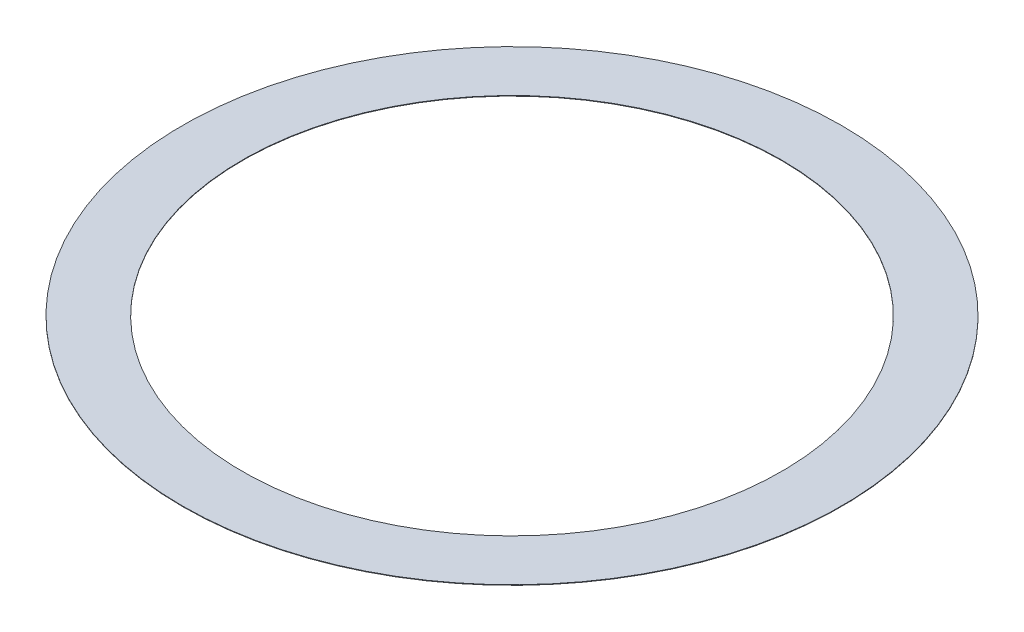
ISO-10303-21;
HEADER;
FILE_DESCRIPTION(('STEP AP214'),'2;1');
FILE_NAME('part.step','',(''),(''),'','','');
FILE_SCHEMA(('AUTOMOTIVE_DESIGN { 1 0 10303 214 1 1 1 1 }'));
ENDSEC;
DATA;
#1=APPLICATION_CONTEXT('core data for automotive mechanical design processes');
#2=APPLICATION_PROTOCOL_DEFINITION('international standard','automotive_design',2000,#1);
#3=PRODUCT_CONTEXT('',#1,'mechanical');
#4=PRODUCT('Part','Part','',(#3));
#5=PRODUCT_RELATED_PRODUCT_CATEGORY('part','',(#4));
#6=PRODUCT_DEFINITION_FORMATION('','',#4);
#7=PRODUCT_DEFINITION_CONTEXT('part definition',#1,'design');
#8=PRODUCT_DEFINITION('design','',#6,#7);
#9=PRODUCT_DEFINITION_SHAPE('','',#8);
#10=(LENGTH_UNIT() NAMED_UNIT(*) SI_UNIT(.MILLI.,.METRE.));
#11=(NAMED_UNIT(*) PLANE_ANGLE_UNIT() SI_UNIT($,.RADIAN.));
#12=(NAMED_UNIT(*) SI_UNIT($,.STERADIAN.) SOLID_ANGLE_UNIT());
#13=UNCERTAINTY_MEASURE_WITH_UNIT(LENGTH_MEASURE(1.E-05),#10,'distance_accuracy_value','');
#14=(GEOMETRIC_REPRESENTATION_CONTEXT(3) GLOBAL_UNCERTAINTY_ASSIGNED_CONTEXT((#13)) GLOBAL_UNIT_ASSIGNED_CONTEXT((#10,
#11,#12)) REPRESENTATION_CONTEXT('',''));
#15=CARTESIAN_POINT('',(0.,0.,0.));
#16=DIRECTION('',(0.,0.,1.));
#17=DIRECTION('',(1.,0.,0.));
#18=AXIS2_PLACEMENT_3D('',#15,#16,#17);
#19=CARTESIAN_POINT('',(4.61366756677371,1.4,-0.922645422350891));
#20=DIRECTION('',(0.,1.,0.));
#21=DIRECTION('',(0.,0.,1.));
#22=AXIS2_PLACEMENT_3D('',#19,#20,#21);
#23=PLANE('',#22);
#24=CARTESIAN_POINT('',(4.61366756677371,1.4,-0.922645422350891));
#25=DIRECTION('',(0.,-1.,0.));
#26=DIRECTION('',(0.,0.,-1.));
#27=AXIS2_PLACEMENT_3D('',#24,#25,#26);
#28=CIRCLE('',#27,0.534659599446457);
#29=CARTESIAN_POINT('',(4.61366756677371,1.4,-1.45730502179735));
#30=VERTEX_POINT('',#29);
#31=EDGE_CURVE('E26',#30,#30,#28,.F.);
#32=ORIENTED_EDGE('',*,*,#31,.T.);
#33=EDGE_LOOP('',(#32));
#34=FACE_BOUND('',#33,.T.);
#35=CARTESIAN_POINT('',(4.61366756677371,1.4,-0.922645422350891));
#36=DIRECTION('',(0.,-1.,0.));
#37=DIRECTION('',(0.,0.,-1.));
#38=AXIS2_PLACEMENT_3D('',#35,#36,#37);
#39=CIRCLE('',#38,0.653338309316951);
#40=CARTESIAN_POINT('',(4.61366756677371,1.4,-1.57598373166784));
#41=VERTEX_POINT('',#40);
#42=EDGE_CURVE('E35',#41,#41,#39,.F.);
#43=ORIENTED_EDGE('',*,*,#42,.F.);
#44=EDGE_LOOP('',(#43));
#45=FACE_BOUND('',#44,.T.);
#46=ADVANCED_FACE('F14',(#34,#45),#23,.F.);
#47=CARTESIAN_POINT('',(4.61366756677371,1.401,-0.922645422350891));
#48=DIRECTION('',(0.,-1.,0.));
#49=DIRECTION('',(0.,0.,-1.));
#50=AXIS2_PLACEMENT_3D('',#47,#48,#49);
#51=CYLINDRICAL_SURFACE('',#50,0.653338309316951);
#52=ORIENTED_EDGE('',*,*,#42,.T.);
#53=EDGE_LOOP('',(#52));
#54=FACE_BOUND('',#53,.T.);
#55=CARTESIAN_POINT('',(4.61366756677371,1.401,-0.922645422350891));
#56=DIRECTION('',(0.,-1.,0.));
#57=DIRECTION('',(0.,0.,-1.));
#58=AXIS2_PLACEMENT_3D('',#55,#56,#57);
#59=CIRCLE('',#58,0.653338309316951);
#60=CARTESIAN_POINT('',(4.61366756677371,1.401,-1.57598373166784));
#61=VERTEX_POINT('',#60);
#62=EDGE_CURVE('E21',#61,#61,#59,.F.);
#63=ORIENTED_EDGE('',*,*,#62,.F.);
#64=EDGE_LOOP('',(#63));
#65=FACE_BOUND('',#64,.T.);
#66=ADVANCED_FACE('F40',(#54,#65),#51,.T.);
#67=CARTESIAN_POINT('',(4.61366756677371,1.401,-0.922645422350891));
#68=DIRECTION('',(0.,-1.,0.));
#69=DIRECTION('',(0.,0.,-1.));
#70=AXIS2_PLACEMENT_3D('',#67,#68,#69);
#71=CYLINDRICAL_SURFACE('',#70,0.534659599446457);
#72=ORIENTED_EDGE('',*,*,#31,.F.);
#73=EDGE_LOOP('',(#72));
#74=FACE_BOUND('',#73,.T.);
#75=CARTESIAN_POINT('',(4.61366756677371,1.401,-0.922645422350891));
#76=DIRECTION('',(0.,-1.,0.));
#77=DIRECTION('',(0.,0.,-1.));
#78=AXIS2_PLACEMENT_3D('',#75,#76,#77);
#79=CIRCLE('',#78,0.534659599446457);
#80=CARTESIAN_POINT('',(4.61366756677371,1.401,-1.45730502179735));
#81=VERTEX_POINT('',#80);
#82=EDGE_CURVE('E10',#81,#81,#79,.T.);
#83=ORIENTED_EDGE('',*,*,#82,.F.);
#84=EDGE_LOOP('',(#83));
#85=FACE_BOUND('',#84,.T.);
#86=ADVANCED_FACE('F49',(#74,#85),#71,.F.);
#87=CARTESIAN_POINT('',(4.61366756677371,1.401,-0.922645422350891));
#88=DIRECTION('',(0.,1.,0.));
#89=DIRECTION('',(0.,0.,1.));
#90=AXIS2_PLACEMENT_3D('',#87,#88,#89);
#91=PLANE('',#90);
#92=ORIENTED_EDGE('',*,*,#82,.T.);
#93=EDGE_LOOP('',(#92));
#94=FACE_BOUND('',#93,.T.);
#95=ORIENTED_EDGE('',*,*,#62,.T.);
#96=EDGE_LOOP('',(#95));
#97=FACE_BOUND('',#96,.T.);
#98=ADVANCED_FACE('F50',(#94,#97),#91,.T.);
#99=CLOSED_SHELL('',(#46,#66,#86,#98));
#100=MANIFOLD_SOLID_BREP('B1',#99);
#101=ADVANCED_BREP_SHAPE_REPRESENTATION('',(#18,#100),#14);
#102=SHAPE_DEFINITION_REPRESENTATION(#9,#101);
ENDSEC;
END-ISO-10303-21;
